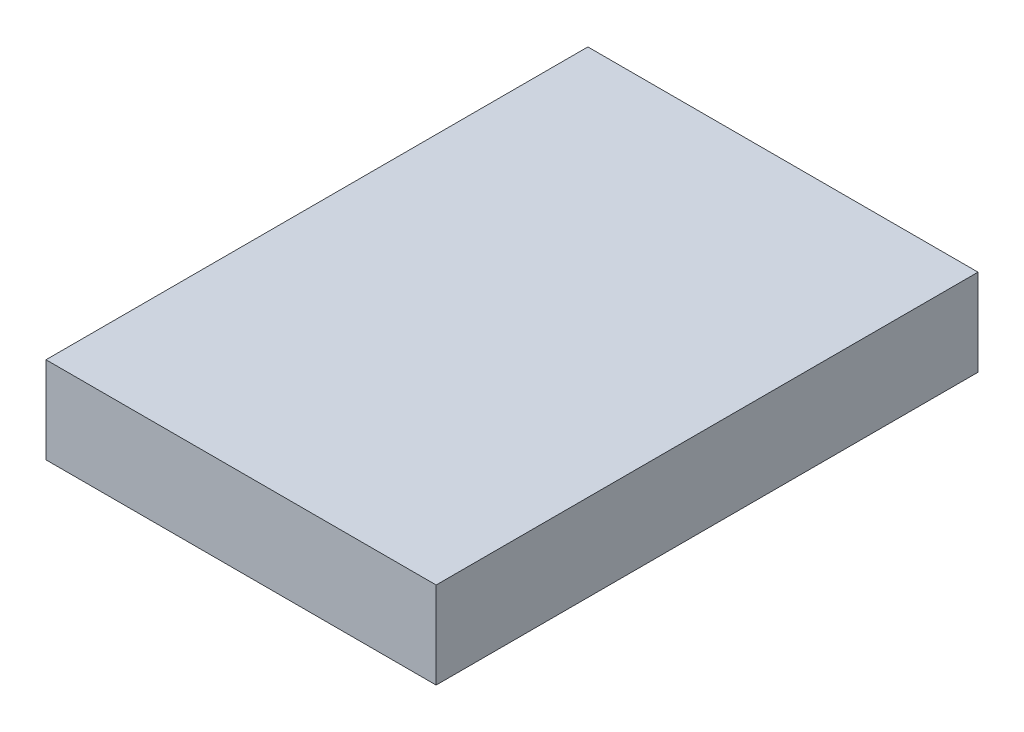
ISO-10303-21;
HEADER;
FILE_DESCRIPTION(('STEP AP214'),'2;1');
FILE_NAME('part.step','',(''),(''),'','','');
FILE_SCHEMA(('AUTOMOTIVE_DESIGN { 1 0 10303 214 1 1 1 1 }'));
ENDSEC;
DATA;
#1=APPLICATION_CONTEXT('core data for automotive mechanical design processes');
#2=APPLICATION_PROTOCOL_DEFINITION('international standard','automotive_design',2000,#1);
#3=PRODUCT_CONTEXT('',#1,'mechanical');
#4=PRODUCT('Part','Part','',(#3));
#5=PRODUCT_RELATED_PRODUCT_CATEGORY('part','',(#4));
#6=PRODUCT_DEFINITION_FORMATION('','',#4);
#7=PRODUCT_DEFINITION_CONTEXT('part definition',#1,'design');
#8=PRODUCT_DEFINITION('design','',#6,#7);
#9=PRODUCT_DEFINITION_SHAPE('','',#8);
#10=(LENGTH_UNIT() NAMED_UNIT(*) SI_UNIT(.MILLI.,.METRE.));
#11=(NAMED_UNIT(*) PLANE_ANGLE_UNIT() SI_UNIT($,.RADIAN.));
#12=(NAMED_UNIT(*) SI_UNIT($,.STERADIAN.) SOLID_ANGLE_UNIT());
#13=UNCERTAINTY_MEASURE_WITH_UNIT(LENGTH_MEASURE(1.E-05),#10,'distance_accuracy_value','');
#14=(GEOMETRIC_REPRESENTATION_CONTEXT(3) GLOBAL_UNCERTAINTY_ASSIGNED_CONTEXT((#13)) GLOBAL_UNIT_ASSIGNED_CONTEXT((#10,
#11,#12)) REPRESENTATION_CONTEXT('',''));
#15=CARTESIAN_POINT('',(0.,0.,0.));
#16=DIRECTION('',(0.,0.,1.));
#17=DIRECTION('',(1.,0.,0.));
#18=AXIS2_PLACEMENT_3D('',#15,#16,#17);
#19=CARTESIAN_POINT('',(0.,0.,0.));
#20=DIRECTION('',(0.,1.,0.));
#21=DIRECTION('',(0.,0.,1.));
#22=AXIS2_PLACEMENT_3D('',#19,#20,#21);
#23=PLANE('',#22);
#24=DIRECTION('',(0.,0.,1.));
#25=VECTOR('',#24,1.);
#26=CARTESIAN_POINT('',(-9.,0.,-16.));
#27=LINE('',#26,#25);
#28=CARTESIAN_POINT('',(-9.,0.,-16.));
#29=VERTEX_POINT('',#28);
#30=CARTESIAN_POINT('',(-9.,0.,9.));
#31=VERTEX_POINT('',#30);
#32=EDGE_CURVE('E124',#29,#31,#27,.T.);
#33=ORIENTED_EDGE('',*,*,#32,.F.);
#34=DIRECTION('',(-1.,0.,0.));
#35=VECTOR('',#34,1.);
#36=CARTESIAN_POINT('',(-9.,0.,-16.));
#37=LINE('',#36,#35);
#38=CARTESIAN_POINT('',(9.,0.,-16.));
#39=VERTEX_POINT('',#38);
#40=EDGE_CURVE('E63',#39,#29,#37,.T.);
#41=ORIENTED_EDGE('',*,*,#40,.F.);
#42=DIRECTION('',(0.,0.,-1.));
#43=VECTOR('',#42,1.);
#44=CARTESIAN_POINT('',(9.,0.,-16.));
#45=LINE('',#44,#43);
#46=CARTESIAN_POINT('',(9.,0.,9.));
#47=VERTEX_POINT('',#46);
#48=EDGE_CURVE('E218',#47,#39,#45,.T.);
#49=ORIENTED_EDGE('',*,*,#48,.F.);
#50=DIRECTION('',(1.,0.,0.));
#51=VECTOR('',#50,1.);
#52=CARTESIAN_POINT('',(-9.,0.,9.));
#53=LINE('',#52,#51);
#54=EDGE_CURVE('E215',#31,#47,#53,.T.);
#55=ORIENTED_EDGE('',*,*,#54,.F.);
#56=EDGE_LOOP('',(#33,#41,#49,#55));
#57=FACE_BOUND('',#56,.T.);
#58=CARTESIAN_POINT('',(-5.,0.,-4.89897948556635));
#59=DIRECTION('',(0.,-1.,0.));
#60=DIRECTION('',(0.,0.,1.));
#61=AXIS2_PLACEMENT_3D('',#58,#59,#60);
#62=CIRCLE('',#61,1.);
#63=CARTESIAN_POINT('',(-4.,0.,-4.89897948556635));
#64=VERTEX_POINT('',#63);
#65=CARTESIAN_POINT('',(-4.28571428571429,0.,-4.19912527334259));
#66=VERTEX_POINT('',#65);
#67=EDGE_CURVE('E55',#64,#66,#62,.T.);
#68=ORIENTED_EDGE('',*,*,#67,.T.);
#69=CARTESIAN_POINT('',(0.,0.,0.));
#70=DIRECTION('',(0.,1.,0.));
#71=DIRECTION('',(0.,0.,1.));
#72=AXIS2_PLACEMENT_3D('',#69,#70,#71);
#73=CIRCLE('',#72,6.);
#74=CARTESIAN_POINT('',(4.28571428571429,0.,-4.19912527334259));
#75=VERTEX_POINT('',#74);
#76=EDGE_CURVE('E175',#66,#75,#73,.T.);
#77=ORIENTED_EDGE('',*,*,#76,.T.);
#78=CARTESIAN_POINT('',(5.,0.,-4.89897948556635));
#79=DIRECTION('',(0.,-1.,0.));
#80=DIRECTION('',(0.,0.,-1.));
#81=AXIS2_PLACEMENT_3D('',#78,#79,#80);
#82=CIRCLE('',#81,1.);
#83=CARTESIAN_POINT('',(4.,0.,-4.89897948556635));
#84=VERTEX_POINT('',#83);
#85=EDGE_CURVE('E179',#75,#84,#82,.T.);
#86=ORIENTED_EDGE('',*,*,#85,.T.);
#87=DIRECTION('',(0.,0.,-1.));
#88=VECTOR('',#87,1.);
#89=CARTESIAN_POINT('',(4.,0.,-5.5));
#90=LINE('',#89,#88);
#91=CARTESIAN_POINT('',(4.,0.,-13.));
#92=VERTEX_POINT('',#91);
#93=EDGE_CURVE('E183',#84,#92,#90,.T.);
#94=ORIENTED_EDGE('',*,*,#93,.T.);
#95=DIRECTION('',(-1.,0.,0.));
#96=VECTOR('',#95,1.);
#97=CARTESIAN_POINT('',(-4.,0.,-13.));
#98=LINE('',#97,#96);
#99=CARTESIAN_POINT('',(-4.,0.,-13.));
#100=VERTEX_POINT('',#99);
#101=EDGE_CURVE('E187',#92,#100,#98,.T.);
#102=ORIENTED_EDGE('',*,*,#101,.T.);
#103=DIRECTION('',(0.,0.,1.));
#104=VECTOR('',#103,1.);
#105=CARTESIAN_POINT('',(-4.,0.,-5.5));
#106=LINE('',#105,#104);
#107=EDGE_CURVE('E152',#100,#64,#106,.T.);
#108=ORIENTED_EDGE('',*,*,#107,.T.);
#109=EDGE_LOOP('',(#68,#77,#86,#94,#102,#108));
#110=FACE_BOUND('',#109,.T.);
#111=ADVANCED_FACE('F39',(#57,#110),#23,.F.);
#112=CARTESIAN_POINT('',(-9.,1.,-16.));
#113=DIRECTION('',(1.,0.,0.));
#114=DIRECTION('',(0.,0.,-1.));
#115=AXIS2_PLACEMENT_3D('',#112,#113,#114);
#116=PLANE('',#115);
#117=ORIENTED_EDGE('',*,*,#32,.T.);
#118=DIRECTION('',(0.,-1.,0.));
#119=VECTOR('',#118,1.);
#120=CARTESIAN_POINT('',(-9.,1.,9.));
#121=LINE('',#120,#119);
#122=CARTESIAN_POINT('',(-9.,4.,9.));
#123=VERTEX_POINT('',#122);
#124=EDGE_CURVE('E11',#123,#31,#121,.T.);
#125=ORIENTED_EDGE('',*,*,#124,.F.);
#126=DIRECTION('',(0.,0.,1.));
#127=VECTOR('',#126,1.);
#128=CARTESIAN_POINT('',(-9.,4.,-16.));
#129=LINE('',#128,#127);
#130=CARTESIAN_POINT('',(-9.,4.,-16.));
#131=VERTEX_POINT('',#130);
#132=EDGE_CURVE('E122',#131,#123,#129,.T.);
#133=ORIENTED_EDGE('',*,*,#132,.F.);
#134=DIRECTION('',(0.,-1.,0.));
#135=VECTOR('',#134,1.);
#136=CARTESIAN_POINT('',(-9.,1.,-16.));
#137=LINE('',#136,#135);
#138=EDGE_CURVE('E223',#131,#29,#137,.T.);
#139=ORIENTED_EDGE('',*,*,#138,.T.);
#140=EDGE_LOOP('',(#117,#125,#133,#139));
#141=FACE_BOUND('',#140,.T.);
#142=ADVANCED_FACE('F41',(#141),#116,.F.);
#143=CARTESIAN_POINT('',(-9.,1.,9.));
#144=DIRECTION('',(0.,0.,-1.));
#145=DIRECTION('',(-1.,0.,0.));
#146=AXIS2_PLACEMENT_3D('',#143,#144,#145);
#147=PLANE('',#146);
#148=ORIENTED_EDGE('',*,*,#54,.T.);
#149=DIRECTION('',(0.,-1.,0.));
#150=VECTOR('',#149,1.);
#151=CARTESIAN_POINT('',(9.,1.,9.));
#152=LINE('',#151,#150);
#153=CARTESIAN_POINT('',(9.,4.,9.));
#154=VERTEX_POINT('',#153);
#155=EDGE_CURVE('E48',#154,#47,#152,.T.);
#156=ORIENTED_EDGE('',*,*,#155,.F.);
#157=DIRECTION('',(1.,0.,0.));
#158=VECTOR('',#157,1.);
#159=CARTESIAN_POINT('',(-9.,4.,9.));
#160=LINE('',#159,#158);
#161=EDGE_CURVE('E127',#123,#154,#160,.T.);
#162=ORIENTED_EDGE('',*,*,#161,.F.);
#163=ORIENTED_EDGE('',*,*,#124,.T.);
#164=EDGE_LOOP('',(#148,#156,#162,#163));
#165=FACE_BOUND('',#164,.T.);
#166=ADVANCED_FACE('F128',(#165),#147,.F.);
#167=CARTESIAN_POINT('',(9.,1.,-16.));
#168=DIRECTION('',(-1.,0.,0.));
#169=DIRECTION('',(0.,0.,1.));
#170=AXIS2_PLACEMENT_3D('',#167,#168,#169);
#171=PLANE('',#170);
#172=ORIENTED_EDGE('',*,*,#48,.T.);
#173=DIRECTION('',(0.,-1.,0.));
#174=VECTOR('',#173,1.);
#175=CARTESIAN_POINT('',(9.,1.,-16.));
#176=LINE('',#175,#174);
#177=CARTESIAN_POINT('',(9.,4.,-16.));
#178=VERTEX_POINT('',#177);
#179=EDGE_CURVE('E226',#178,#39,#176,.T.);
#180=ORIENTED_EDGE('',*,*,#179,.F.);
#181=DIRECTION('',(0.,0.,-1.));
#182=VECTOR('',#181,1.);
#183=CARTESIAN_POINT('',(9.,4.,-16.));
#184=LINE('',#183,#182);
#185=EDGE_CURVE('E134',#154,#178,#184,.T.);
#186=ORIENTED_EDGE('',*,*,#185,.F.);
#187=ORIENTED_EDGE('',*,*,#155,.T.);
#188=EDGE_LOOP('',(#172,#180,#186,#187));
#189=FACE_BOUND('',#188,.T.);
#190=ADVANCED_FACE('F231',(#189),#171,.F.);
#191=CARTESIAN_POINT('',(-9.,1.,-16.));
#192=DIRECTION('',(0.,0.,1.));
#193=DIRECTION('',(1.,0.,0.));
#194=AXIS2_PLACEMENT_3D('',#191,#192,#193);
#195=PLANE('',#194);
#196=ORIENTED_EDGE('',*,*,#40,.T.);
#197=ORIENTED_EDGE('',*,*,#138,.F.);
#198=DIRECTION('',(-1.,0.,0.));
#199=VECTOR('',#198,1.);
#200=CARTESIAN_POINT('',(-9.,4.,-16.));
#201=LINE('',#200,#199);
#202=EDGE_CURVE('E139',#178,#131,#201,.T.);
#203=ORIENTED_EDGE('',*,*,#202,.F.);
#204=ORIENTED_EDGE('',*,*,#179,.T.);
#205=EDGE_LOOP('',(#196,#197,#203,#204));
#206=FACE_BOUND('',#205,.T.);
#207=ADVANCED_FACE('F257',(#206),#195,.F.);
#208=CARTESIAN_POINT('',(-5.,1.,-4.89897948556635));
#209=DIRECTION('',(0.,-1.,0.));
#210=DIRECTION('',(0.,0.,-1.));
#211=AXIS2_PLACEMENT_3D('',#208,#209,#210);
#212=CYLINDRICAL_SURFACE('',#211,1.);
#213=ORIENTED_EDGE('',*,*,#67,.F.);
#214=DIRECTION('',(0.,-1.,0.));
#215=VECTOR('',#214,1.);
#216=CARTESIAN_POINT('',(-4.,1.,-4.89897948556635));
#217=LINE('',#216,#215);
#218=CARTESIAN_POINT('',(-4.,1.,-4.89897948556635));
#219=VERTEX_POINT('',#218);
#220=EDGE_CURVE('E172',#219,#64,#217,.T.);
#221=ORIENTED_EDGE('',*,*,#220,.F.);
#222=CARTESIAN_POINT('',(-5.,1.,-4.89897948556635));
#223=DIRECTION('',(0.,-1.,0.));
#224=DIRECTION('',(0.,0.,1.));
#225=AXIS2_PLACEMENT_3D('',#222,#223,#224);
#226=CIRCLE('',#225,1.);
#227=CARTESIAN_POINT('',(-4.28571428571429,1.,-4.19912527334259));
#228=VERTEX_POINT('',#227);
#229=EDGE_CURVE('E147',#219,#228,#226,.T.);
#230=ORIENTED_EDGE('',*,*,#229,.T.);
#231=DIRECTION('',(0.,-1.,0.));
#232=VECTOR('',#231,1.);
#233=CARTESIAN_POINT('',(-4.28571428571429,1.,-4.19912527334259));
#234=LINE('',#233,#232);
#235=EDGE_CURVE('E210',#228,#66,#234,.T.);
#236=ORIENTED_EDGE('',*,*,#235,.T.);
#237=EDGE_LOOP('',(#213,#221,#230,#236));
#238=FACE_BOUND('',#237,.T.);
#239=ADVANCED_FACE('F255',(#238),#212,.T.);
#240=CARTESIAN_POINT('',(0.,1.,0.));
#241=DIRECTION('',(0.,-1.,0.));
#242=DIRECTION('',(0.,0.,-1.));
#243=AXIS2_PLACEMENT_3D('',#240,#241,#242);
#244=CYLINDRICAL_SURFACE('',#243,6.);
#245=ORIENTED_EDGE('',*,*,#76,.F.);
#246=ORIENTED_EDGE('',*,*,#235,.F.);
#247=CARTESIAN_POINT('',(0.,1.,0.));
#248=DIRECTION('',(0.,1.,0.));
#249=DIRECTION('',(0.,0.,1.));
#250=AXIS2_PLACEMENT_3D('',#247,#248,#249);
#251=CIRCLE('',#250,6.);
#252=CARTESIAN_POINT('',(4.28571428571429,1.,-4.19912527334259));
#253=VERTEX_POINT('',#252);
#254=EDGE_CURVE('E151',#228,#253,#251,.T.);
#255=ORIENTED_EDGE('',*,*,#254,.T.);
#256=DIRECTION('',(0.,-1.,0.));
#257=VECTOR('',#256,1.);
#258=CARTESIAN_POINT('',(4.28571428571429,1.,-4.19912527334259));
#259=LINE('',#258,#257);
#260=EDGE_CURVE('E207',#253,#75,#259,.T.);
#261=ORIENTED_EDGE('',*,*,#260,.T.);
#262=EDGE_LOOP('',(#245,#246,#255,#261));
#263=FACE_BOUND('',#262,.T.);
#264=ADVANCED_FACE('F254',(#263),#244,.F.);
#265=CARTESIAN_POINT('',(5.,1.,-4.89897948556635));
#266=DIRECTION('',(0.,-1.,0.));
#267=DIRECTION('',(0.,0.,-1.));
#268=AXIS2_PLACEMENT_3D('',#265,#266,#267);
#269=CYLINDRICAL_SURFACE('',#268,1.);
#270=ORIENTED_EDGE('',*,*,#85,.F.);
#271=ORIENTED_EDGE('',*,*,#260,.F.);
#272=CARTESIAN_POINT('',(5.,1.,-4.89897948556635));
#273=DIRECTION('',(0.,-1.,0.));
#274=DIRECTION('',(0.,0.,-1.));
#275=AXIS2_PLACEMENT_3D('',#272,#273,#274);
#276=CIRCLE('',#275,1.);
#277=CARTESIAN_POINT('',(4.,1.,-4.89897948556635));
#278=VERTEX_POINT('',#277);
#279=EDGE_CURVE('E156',#253,#278,#276,.T.);
#280=ORIENTED_EDGE('',*,*,#279,.T.);
#281=DIRECTION('',(0.,-1.,0.));
#282=VECTOR('',#281,1.);
#283=CARTESIAN_POINT('',(4.,1.,-4.89897948556635));
#284=LINE('',#283,#282);
#285=EDGE_CURVE('E203',#278,#84,#284,.T.);
#286=ORIENTED_EDGE('',*,*,#285,.T.);
#287=EDGE_LOOP('',(#270,#271,#280,#286));
#288=FACE_BOUND('',#287,.T.);
#289=ADVANCED_FACE('F250',(#288),#269,.T.);
#290=CARTESIAN_POINT('',(4.,1.,-5.5));
#291=DIRECTION('',(-1.,0.,0.));
#292=DIRECTION('',(0.,0.,1.));
#293=AXIS2_PLACEMENT_3D('',#290,#291,#292);
#294=PLANE('',#293);
#295=ORIENTED_EDGE('',*,*,#93,.F.);
#296=ORIENTED_EDGE('',*,*,#285,.F.);
#297=DIRECTION('',(0.,0.,-1.));
#298=VECTOR('',#297,1.);
#299=CARTESIAN_POINT('',(4.,1.,-5.5));
#300=LINE('',#299,#298);
#301=CARTESIAN_POINT('',(4.,1.,-13.));
#302=VERTEX_POINT('',#301);
#303=EDGE_CURVE('E160',#278,#302,#300,.T.);
#304=ORIENTED_EDGE('',*,*,#303,.T.);
#305=DIRECTION('',(0.,-1.,0.));
#306=VECTOR('',#305,1.);
#307=CARTESIAN_POINT('',(4.,1.,-13.));
#308=LINE('',#307,#306);
#309=EDGE_CURVE('E200',#302,#92,#308,.T.);
#310=ORIENTED_EDGE('',*,*,#309,.T.);
#311=EDGE_LOOP('',(#295,#296,#304,#310));
#312=FACE_BOUND('',#311,.T.);
#313=ADVANCED_FACE('F247',(#312),#294,.T.);
#314=CARTESIAN_POINT('',(-4.,1.,-13.));
#315=DIRECTION('',(0.,0.,1.));
#316=DIRECTION('',(1.,0.,0.));
#317=AXIS2_PLACEMENT_3D('',#314,#315,#316);
#318=PLANE('',#317);
#319=ORIENTED_EDGE('',*,*,#101,.F.);
#320=ORIENTED_EDGE('',*,*,#309,.F.);
#321=DIRECTION('',(-1.,0.,0.));
#322=VECTOR('',#321,1.);
#323=CARTESIAN_POINT('',(-4.,1.,-13.));
#324=LINE('',#323,#322);
#325=CARTESIAN_POINT('',(-4.,1.,-13.));
#326=VERTEX_POINT('',#325);
#327=EDGE_CURVE('E164',#302,#326,#324,.T.);
#328=ORIENTED_EDGE('',*,*,#327,.T.);
#329=DIRECTION('',(0.,-1.,0.));
#330=VECTOR('',#329,1.);
#331=CARTESIAN_POINT('',(-4.,1.,-13.));
#332=LINE('',#331,#330);
#333=EDGE_CURVE('E196',#326,#100,#332,.T.);
#334=ORIENTED_EDGE('',*,*,#333,.T.);
#335=EDGE_LOOP('',(#319,#320,#328,#334));
#336=FACE_BOUND('',#335,.T.);
#337=ADVANCED_FACE('F241',(#336),#318,.T.);
#338=CARTESIAN_POINT('',(-4.,1.,-5.5));
#339=DIRECTION('',(1.,0.,0.));
#340=DIRECTION('',(0.,0.,-1.));
#341=AXIS2_PLACEMENT_3D('',#338,#339,#340);
#342=PLANE('',#341);
#343=ORIENTED_EDGE('',*,*,#107,.F.);
#344=ORIENTED_EDGE('',*,*,#333,.F.);
#345=DIRECTION('',(0.,0.,1.));
#346=VECTOR('',#345,1.);
#347=CARTESIAN_POINT('',(-4.,1.,-5.5));
#348=LINE('',#347,#346);
#349=EDGE_CURVE('E168',#326,#219,#348,.T.);
#350=ORIENTED_EDGE('',*,*,#349,.T.);
#351=ORIENTED_EDGE('',*,*,#220,.T.);
#352=EDGE_LOOP('',(#343,#344,#350,#351));
#353=FACE_BOUND('',#352,.T.);
#354=ADVANCED_FACE('F239',(#353),#342,.T.);
#355=CARTESIAN_POINT('',(0.,1.,0.));
#356=DIRECTION('',(0.,1.,0.));
#357=DIRECTION('',(0.,0.,1.));
#358=AXIS2_PLACEMENT_3D('',#355,#356,#357);
#359=PLANE('',#358);
#360=ORIENTED_EDGE('',*,*,#254,.F.);
#361=ORIENTED_EDGE('',*,*,#229,.F.);
#362=ORIENTED_EDGE('',*,*,#349,.F.);
#363=ORIENTED_EDGE('',*,*,#327,.F.);
#364=ORIENTED_EDGE('',*,*,#303,.F.);
#365=ORIENTED_EDGE('',*,*,#279,.F.);
#366=EDGE_LOOP('',(#360,#361,#362,#363,#364,#365));
#367=FACE_BOUND('',#366,.T.);
#368=ADVANCED_FACE('F244',(#367),#359,.F.);
#369=CARTESIAN_POINT('',(0.,4.,0.));
#370=DIRECTION('',(0.,1.,0.));
#371=DIRECTION('',(0.,0.,1.));
#372=AXIS2_PLACEMENT_3D('',#369,#370,#371);
#373=PLANE('',#372);
#374=ORIENTED_EDGE('',*,*,#132,.T.);
#375=ORIENTED_EDGE('',*,*,#161,.T.);
#376=ORIENTED_EDGE('',*,*,#185,.T.);
#377=ORIENTED_EDGE('',*,*,#202,.T.);
#378=EDGE_LOOP('',(#374,#375,#376,#377));
#379=FACE_BOUND('',#378,.T.);
#380=ADVANCED_FACE('F137',(#379),#373,.T.);
#381=CLOSED_SHELL('',(#111,#142,#166,#190,#207,#239,#264,#289,#313,#337,#354,#368,#380));
#382=MANIFOLD_SOLID_BREP('B2',#381);
#383=ADVANCED_BREP_SHAPE_REPRESENTATION('',(#18,#382),#14);
#384=SHAPE_DEFINITION_REPRESENTATION(#9,#383);
ENDSEC;
END-ISO-10303-21;
